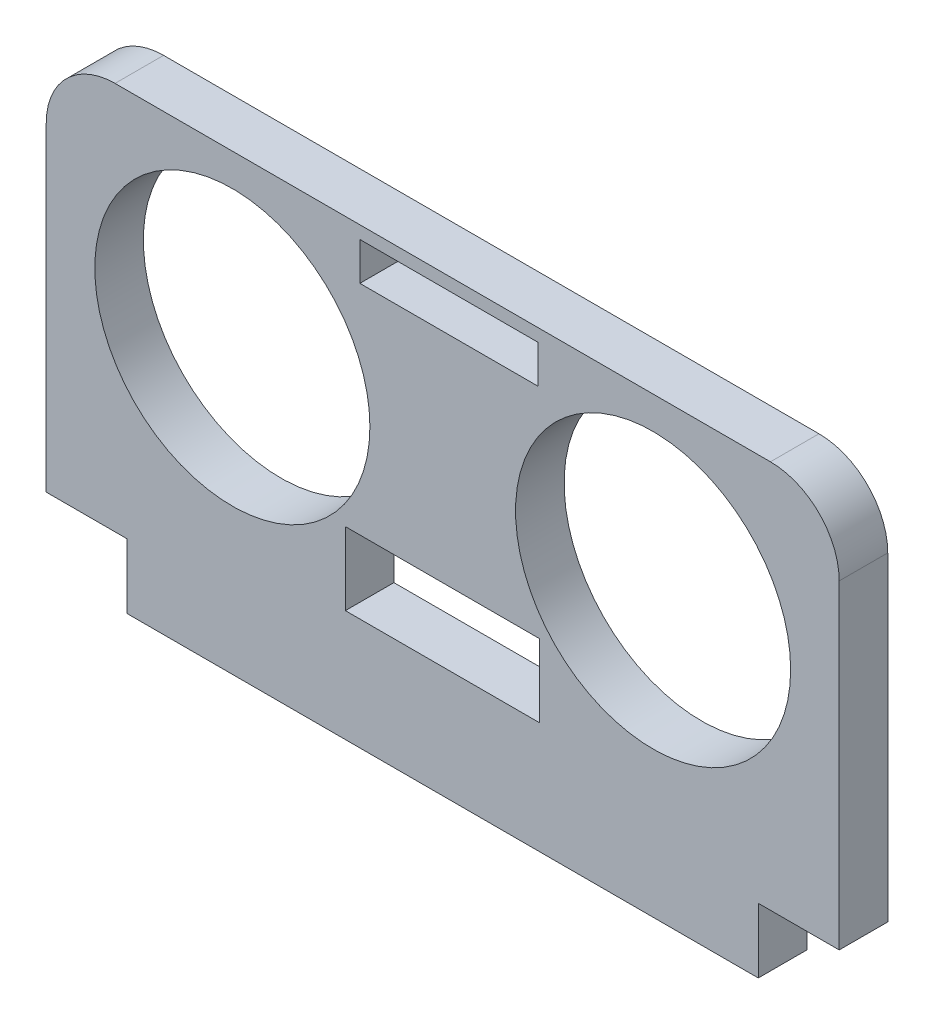
ISO-10303-21;
HEADER;
FILE_DESCRIPTION(('STEP AP214'),'2;1');
FILE_NAME('part.step','',(''),(''),'','','');
FILE_SCHEMA(('AUTOMOTIVE_DESIGN { 1 0 10303 214 1 1 1 1 }'));
ENDSEC;
DATA;
#1=APPLICATION_CONTEXT('core data for automotive mechanical design processes');
#2=APPLICATION_PROTOCOL_DEFINITION('international standard','automotive_design',2000,#1);
#3=PRODUCT_CONTEXT('',#1,'mechanical');
#4=PRODUCT('Part','Part','',(#3));
#5=PRODUCT_RELATED_PRODUCT_CATEGORY('part','',(#4));
#6=PRODUCT_DEFINITION_FORMATION('','',#4);
#7=PRODUCT_DEFINITION_CONTEXT('part definition',#1,'design');
#8=PRODUCT_DEFINITION('design','',#6,#7);
#9=PRODUCT_DEFINITION_SHAPE('','',#8);
#10=(LENGTH_UNIT() NAMED_UNIT(*) SI_UNIT(.MILLI.,.METRE.));
#11=(NAMED_UNIT(*) PLANE_ANGLE_UNIT() SI_UNIT($,.RADIAN.));
#12=(NAMED_UNIT(*) SI_UNIT($,.STERADIAN.) SOLID_ANGLE_UNIT());
#13=UNCERTAINTY_MEASURE_WITH_UNIT(LENGTH_MEASURE(1.E-05),#10,'distance_accuracy_value','');
#14=(GEOMETRIC_REPRESENTATION_CONTEXT(3) GLOBAL_UNCERTAINTY_ASSIGNED_CONTEXT((#13)) GLOBAL_UNIT_ASSIGNED_CONTEXT((#10,
#11,#12)) REPRESENTATION_CONTEXT('',''));
#15=CARTESIAN_POINT('',(0.,0.,0.));
#16=DIRECTION('',(0.,0.,1.));
#17=DIRECTION('',(1.,0.,0.));
#18=AXIS2_PLACEMENT_3D('',#15,#16,#17);
#19=CARTESIAN_POINT('',(-22.9735145661851,14.6917065986435,3.));
#20=DIRECTION('',(0.,0.,-1.));
#21=DIRECTION('',(-1.,0.,0.));
#22=AXIS2_PLACEMENT_3D('',#19,#20,#21);
#23=PLANE('',#22);
#24=DIRECTION('',(0.,-1.,0.));
#25=VECTOR('',#24,1.);
#26=CARTESIAN_POINT('',(-49.2402979014695,2.34191465970292,3.));
#27=LINE('',#26,#25);
#28=CARTESIAN_POINT('',(-49.2402979014695,2.34191465970292,3.));
#29=VERTEX_POINT('',#28);
#30=CARTESIAN_POINT('',(-49.2402979014695,-2.15808534029708,3.));
#31=VERTEX_POINT('',#30);
#32=EDGE_CURVE('E193',#29,#31,#27,.T.);
#33=ORIENTED_EDGE('',*,*,#32,.F.);
#34=DIRECTION('',(-1.,0.,0.));
#35=VECTOR('',#34,1.);
#36=CARTESIAN_POINT('',(-49.2402979014695,2.34191465970292,3.));
#37=LINE('',#36,#35);
#38=CARTESIAN_POINT('',(-37.2402979014695,2.34191465970292,3.));
#39=VERTEX_POINT('',#38);
#40=EDGE_CURVE('E201',#39,#29,#37,.T.);
#41=ORIENTED_EDGE('',*,*,#40,.F.);
#42=DIRECTION('',(0.,1.,0.));
#43=VECTOR('',#42,1.);
#44=CARTESIAN_POINT('',(-37.2402979014695,2.34191465970292,3.));
#45=LINE('',#44,#43);
#46=CARTESIAN_POINT('',(-37.2402979014695,-2.15808534029708,3.));
#47=VERTEX_POINT('',#46);
#48=EDGE_CURVE('E198',#47,#39,#45,.T.);
#49=ORIENTED_EDGE('',*,*,#48,.F.);
#50=DIRECTION('',(1.,0.,0.));
#51=VECTOR('',#50,1.);
#52=CARTESIAN_POINT('',(-49.2402979014695,-2.15808534029708,3.));
#53=LINE('',#52,#51);
#54=EDGE_CURVE('E195',#31,#47,#53,.T.);
#55=ORIENTED_EDGE('',*,*,#54,.F.);
#56=EDGE_LOOP('',(#33,#41,#49,#55));
#57=FACE_BOUND('',#56,.T.);
#58=DIRECTION('',(0.,-1.,0.));
#59=VECTOR('',#58,1.);
#60=CARTESIAN_POINT('',(-62.7235145661851,-5.05829340135652,3.));
#61=LINE('',#60,#59);
#62=CARTESIAN_POINT('',(-62.7235145661851,-5.05829340135652,3.));
#63=VERTEX_POINT('',#62);
#64=CARTESIAN_POINT('',(-62.7235145661851,-9.05829340135652,3.));
#65=VERTEX_POINT('',#64);
#66=EDGE_CURVE('E236',#63,#65,#61,.T.);
#67=ORIENTED_EDGE('',*,*,#66,.T.);
#68=DIRECTION('',(1.,0.,0.));
#69=VECTOR('',#68,1.);
#70=CARTESIAN_POINT('',(-62.7235145661851,-9.05829340135652,3.));
#71=LINE('',#70,#69);
#72=CARTESIAN_POINT('',(-23.7235145661851,-9.05829340135652,3.));
#73=VERTEX_POINT('',#72);
#74=EDGE_CURVE('E239',#65,#73,#71,.T.);
#75=ORIENTED_EDGE('',*,*,#74,.T.);
#76=DIRECTION('',(0.,1.,0.));
#77=VECTOR('',#76,1.);
#78=CARTESIAN_POINT('',(-23.7235145661851,-5.05829340135652,3.));
#79=LINE('',#78,#77);
#80=CARTESIAN_POINT('',(-23.7235145661851,-5.05829340135652,3.));
#81=VERTEX_POINT('',#80);
#82=EDGE_CURVE('E242',#73,#81,#79,.T.);
#83=ORIENTED_EDGE('',*,*,#82,.T.);
#84=DIRECTION('',(1.,0.,0.));
#85=VECTOR('',#84,1.);
#86=CARTESIAN_POINT('',(-18.7235145661851,-5.05829340135652,3.));
#87=LINE('',#86,#85);
#88=CARTESIAN_POINT('',(-18.7235145661851,-5.05829340135652,3.));
#89=VERTEX_POINT('',#88);
#90=EDGE_CURVE('E244',#81,#89,#87,.T.);
#91=ORIENTED_EDGE('',*,*,#90,.T.);
#92=DIRECTION('',(0.,1.,0.));
#93=VECTOR('',#92,1.);
#94=CARTESIAN_POINT('',(-18.7235145661851,-5.05829340135652,3.));
#95=LINE('',#94,#93);
#96=CARTESIAN_POINT('',(-18.7235145661851,14.6917065986435,3.));
#97=VERTEX_POINT('',#96);
#98=EDGE_CURVE('E246',#89,#97,#95,.T.);
#99=ORIENTED_EDGE('',*,*,#98,.T.);
#100=CARTESIAN_POINT('',(-22.9735145661851,14.6917065986435,3.));
#101=DIRECTION('',(0.,0.,1.));
#102=DIRECTION('',(-1.,0.,0.));
#103=AXIS2_PLACEMENT_3D('',#100,#101,#102);
#104=CIRCLE('',#103,4.25);
#105=CARTESIAN_POINT('',(-22.9735145661851,18.9417065986435,3.));
#106=VERTEX_POINT('',#105);
#107=EDGE_CURVE('E248',#97,#106,#104,.T.);
#108=ORIENTED_EDGE('',*,*,#107,.T.);
#109=DIRECTION('',(-1.,0.,0.));
#110=VECTOR('',#109,1.);
#111=CARTESIAN_POINT('',(-22.9735145661851,18.9417065986435,3.));
#112=LINE('',#111,#110);
#113=CARTESIAN_POINT('',(-63.4735145661851,18.9417065986435,3.));
#114=VERTEX_POINT('',#113);
#115=EDGE_CURVE('E250',#106,#114,#112,.T.);
#116=ORIENTED_EDGE('',*,*,#115,.T.);
#117=CARTESIAN_POINT('',(-63.4735145661851,14.6917065986435,3.));
#118=DIRECTION('',(0.,0.,1.));
#119=DIRECTION('',(1.,0.,0.));
#120=AXIS2_PLACEMENT_3D('',#117,#118,#119);
#121=CIRCLE('',#120,4.25);
#122=CARTESIAN_POINT('',(-67.7235145661851,14.6917065986435,3.));
#123=VERTEX_POINT('',#122);
#124=EDGE_CURVE('E252',#114,#123,#121,.T.);
#125=ORIENTED_EDGE('',*,*,#124,.T.);
#126=DIRECTION('',(0.,-1.,0.));
#127=VECTOR('',#126,1.);
#128=CARTESIAN_POINT('',(-67.7235145661851,14.6917065986435,3.));
#129=LINE('',#128,#127);
#130=CARTESIAN_POINT('',(-67.7235145661851,-5.05829340135652,3.));
#131=VERTEX_POINT('',#130);
#132=EDGE_CURVE('E254',#123,#131,#129,.T.);
#133=ORIENTED_EDGE('',*,*,#132,.T.);
#134=DIRECTION('',(1.,0.,0.));
#135=VECTOR('',#134,1.);
#136=CARTESIAN_POINT('',(-67.7235145661851,-5.05829340135652,3.));
#137=LINE('',#136,#135);
#138=EDGE_CURVE('E256',#131,#63,#137,.T.);
#139=ORIENTED_EDGE('',*,*,#138,.T.);
#140=EDGE_LOOP('',(#67,#75,#83,#91,#99,#108,#116,#125,#133,#139));
#141=FACE_BOUND('',#140,.T.);
#142=CARTESIAN_POINT('',(-56.2235145661851,8.44170659864349,3.));
#143=DIRECTION('',(0.,0.,1.));
#144=DIRECTION('',(1.,0.,0.));
#145=AXIS2_PLACEMENT_3D('',#142,#143,#144);
#146=CIRCLE('',#145,8.5);
#147=CARTESIAN_POINT('',(-47.7235145661851,8.44170659864349,3.));
#148=VERTEX_POINT('',#147);
#149=EDGE_CURVE('E230',#148,#148,#146,.T.);
#150=ORIENTED_EDGE('',*,*,#149,.F.);
#151=EDGE_LOOP('',(#150));
#152=FACE_BOUND('',#151,.T.);
#153=CARTESIAN_POINT('',(-30.2235145661851,8.44170659864349,3.));
#154=DIRECTION('',(0.,0.,1.));
#155=DIRECTION('',(1.,0.,0.));
#156=AXIS2_PLACEMENT_3D('',#153,#154,#155);
#157=CIRCLE('',#156,8.5);
#158=CARTESIAN_POINT('',(-21.7235145661851,8.44170659864349,3.));
#159=VERTEX_POINT('',#158);
#160=EDGE_CURVE('E224',#159,#159,#157,.T.);
#161=ORIENTED_EDGE('',*,*,#160,.F.);
#162=EDGE_LOOP('',(#161));
#163=FACE_BOUND('',#162,.T.);
#164=DIRECTION('',(0.,-1.,0.));
#165=VECTOR('',#164,1.);
#166=CARTESIAN_POINT('',(-48.3444822603578,18.154921863778,3.));
#167=LINE('',#166,#165);
#168=CARTESIAN_POINT('',(-48.3444822603578,18.154921863778,3.));
#169=VERTEX_POINT('',#168);
#170=CARTESIAN_POINT('',(-48.3444822603578,15.804921863778,3.));
#171=VERTEX_POINT('',#170);
#172=EDGE_CURVE('E157',#169,#171,#167,.T.);
#173=ORIENTED_EDGE('',*,*,#172,.F.);
#174=DIRECTION('',(-1.,0.,0.));
#175=VECTOR('',#174,1.);
#176=CARTESIAN_POINT('',(-48.3444822603578,18.154921863778,3.));
#177=LINE('',#176,#175);
#178=CARTESIAN_POINT('',(-37.3444822603578,18.154921863778,3.));
#179=VERTEX_POINT('',#178);
#180=EDGE_CURVE('E179',#179,#169,#177,.T.);
#181=ORIENTED_EDGE('',*,*,#180,.F.);
#182=DIRECTION('',(0.,1.,0.));
#183=VECTOR('',#182,1.);
#184=CARTESIAN_POINT('',(-37.3444822603578,18.154921863778,3.));
#185=LINE('',#184,#183);
#186=CARTESIAN_POINT('',(-37.3444822603578,15.804921863778,3.));
#187=VERTEX_POINT('',#186);
#188=EDGE_CURVE('E177',#187,#179,#185,.T.);
#189=ORIENTED_EDGE('',*,*,#188,.F.);
#190=DIRECTION('',(1.,0.,0.));
#191=VECTOR('',#190,1.);
#192=CARTESIAN_POINT('',(-48.3444822603578,15.804921863778,3.));
#193=LINE('',#192,#191);
#194=EDGE_CURVE('E165',#171,#187,#193,.T.);
#195=ORIENTED_EDGE('',*,*,#194,.F.);
#196=EDGE_LOOP('',(#173,#181,#189,#195));
#197=FACE_BOUND('',#196,.T.);
#198=ADVANCED_FACE('F32',(#57,#141,#152,#163,#197),#23,.F.);
#199=CARTESIAN_POINT('',(-22.9735145661851,14.6917065986435,0.));
#200=DIRECTION('',(0.,0.,-1.));
#201=DIRECTION('',(-1.,0.,0.));
#202=AXIS2_PLACEMENT_3D('',#199,#200,#201);
#203=PLANE('',#202);
#204=CARTESIAN_POINT('',(-56.2235145661851,8.44170659864349,0.));
#205=DIRECTION('',(0.,0.,1.));
#206=DIRECTION('',(1.,0.,0.));
#207=AXIS2_PLACEMENT_3D('',#204,#205,#206);
#208=CIRCLE('',#207,8.5);
#209=CARTESIAN_POINT('',(-47.7235145661851,8.44170659864349,0.));
#210=VERTEX_POINT('',#209);
#211=EDGE_CURVE('E227',#210,#210,#208,.T.);
#212=ORIENTED_EDGE('',*,*,#211,.T.);
#213=EDGE_LOOP('',(#212));
#214=FACE_BOUND('',#213,.T.);
#215=DIRECTION('',(0.,-1.,0.));
#216=VECTOR('',#215,1.);
#217=CARTESIAN_POINT('',(-62.7235145661851,-5.05829340135652,0.));
#218=LINE('',#217,#216);
#219=CARTESIAN_POINT('',(-62.7235145661851,-5.05829340135652,0.));
#220=VERTEX_POINT('',#219);
#221=CARTESIAN_POINT('',(-62.7235145661851,-9.05829340135652,0.));
#222=VERTEX_POINT('',#221);
#223=EDGE_CURVE('E233',#220,#222,#218,.T.);
#224=ORIENTED_EDGE('',*,*,#223,.F.);
#225=DIRECTION('',(1.,0.,0.));
#226=VECTOR('',#225,1.);
#227=CARTESIAN_POINT('',(-67.7235145661851,-5.05829340135652,0.));
#228=LINE('',#227,#226);
#229=CARTESIAN_POINT('',(-67.7235145661851,-5.05829340135652,0.));
#230=VERTEX_POINT('',#229);
#231=EDGE_CURVE('E240',#230,#220,#228,.T.);
#232=ORIENTED_EDGE('',*,*,#231,.F.);
#233=DIRECTION('',(0.,-1.,0.));
#234=VECTOR('',#233,1.);
#235=CARTESIAN_POINT('',(-67.7235145661851,14.6917065986435,0.));
#236=LINE('',#235,#234);
#237=CARTESIAN_POINT('',(-67.7235145661851,14.6917065986435,0.));
#238=VERTEX_POINT('',#237);
#239=EDGE_CURVE('E275',#238,#230,#236,.T.);
#240=ORIENTED_EDGE('',*,*,#239,.F.);
#241=CARTESIAN_POINT('',(-63.4735145661851,14.6917065986435,0.));
#242=DIRECTION('',(0.,0.,1.));
#243=DIRECTION('',(1.,0.,0.));
#244=AXIS2_PLACEMENT_3D('',#241,#242,#243);
#245=CIRCLE('',#244,4.25);
#246=CARTESIAN_POINT('',(-63.4735145661851,18.9417065986435,0.));
#247=VERTEX_POINT('',#246);
#248=EDGE_CURVE('E273',#247,#238,#245,.T.);
#249=ORIENTED_EDGE('',*,*,#248,.F.);
#250=DIRECTION('',(-1.,0.,0.));
#251=VECTOR('',#250,1.);
#252=CARTESIAN_POINT('',(-22.9735145661851,18.9417065986435,0.));
#253=LINE('',#252,#251);
#254=CARTESIAN_POINT('',(-22.9735145661851,18.9417065986435,0.));
#255=VERTEX_POINT('',#254);
#256=EDGE_CURVE('E271',#255,#247,#253,.T.);
#257=ORIENTED_EDGE('',*,*,#256,.F.);
#258=CARTESIAN_POINT('',(-22.9735145661851,14.6917065986435,0.));
#259=DIRECTION('',(0.,0.,1.));
#260=DIRECTION('',(-1.,0.,0.));
#261=AXIS2_PLACEMENT_3D('',#258,#259,#260);
#262=CIRCLE('',#261,4.25);
#263=CARTESIAN_POINT('',(-18.7235145661851,14.6917065986435,0.));
#264=VERTEX_POINT('',#263);
#265=EDGE_CURVE('E269',#264,#255,#262,.T.);
#266=ORIENTED_EDGE('',*,*,#265,.F.);
#267=DIRECTION('',(0.,1.,0.));
#268=VECTOR('',#267,1.);
#269=CARTESIAN_POINT('',(-18.7235145661851,-5.05829340135652,0.));
#270=LINE('',#269,#268);
#271=CARTESIAN_POINT('',(-18.7235145661851,-5.05829340135652,0.));
#272=VERTEX_POINT('',#271);
#273=EDGE_CURVE('E267',#272,#264,#270,.T.);
#274=ORIENTED_EDGE('',*,*,#273,.F.);
#275=DIRECTION('',(1.,0.,0.));
#276=VECTOR('',#275,1.);
#277=CARTESIAN_POINT('',(-18.7235145661851,-5.05829340135652,0.));
#278=LINE('',#277,#276);
#279=CARTESIAN_POINT('',(-23.7235145661851,-5.05829340135652,0.));
#280=VERTEX_POINT('',#279);
#281=EDGE_CURVE('E265',#280,#272,#278,.T.);
#282=ORIENTED_EDGE('',*,*,#281,.F.);
#283=DIRECTION('',(0.,1.,0.));
#284=VECTOR('',#283,1.);
#285=CARTESIAN_POINT('',(-23.7235145661851,-5.05829340135652,0.));
#286=LINE('',#285,#284);
#287=CARTESIAN_POINT('',(-23.7235145661851,-9.05829340135652,0.));
#288=VERTEX_POINT('',#287);
#289=EDGE_CURVE('E263',#288,#280,#286,.T.);
#290=ORIENTED_EDGE('',*,*,#289,.F.);
#291=DIRECTION('',(1.,0.,0.));
#292=VECTOR('',#291,1.);
#293=CARTESIAN_POINT('',(-62.7235145661851,-9.05829340135652,0.));
#294=LINE('',#293,#292);
#295=EDGE_CURVE('E261',#222,#288,#294,.T.);
#296=ORIENTED_EDGE('',*,*,#295,.F.);
#297=EDGE_LOOP('',(#224,#232,#240,#249,#257,#266,#274,#282,#290,#296));
#298=FACE_BOUND('',#297,.T.);
#299=CARTESIAN_POINT('',(-30.2235145661851,8.44170659864349,0.));
#300=DIRECTION('',(0.,0.,1.));
#301=DIRECTION('',(1.,0.,0.));
#302=AXIS2_PLACEMENT_3D('',#299,#300,#301);
#303=CIRCLE('',#302,8.5);
#304=CARTESIAN_POINT('',(-21.7235145661851,8.44170659864349,0.));
#305=VERTEX_POINT('',#304);
#306=EDGE_CURVE('E223',#305,#305,#303,.T.);
#307=ORIENTED_EDGE('',*,*,#306,.T.);
#308=EDGE_LOOP('',(#307));
#309=FACE_BOUND('',#308,.T.);
#310=DIRECTION('',(-1.,0.,0.));
#311=VECTOR('',#310,1.);
#312=CARTESIAN_POINT('',(-49.2402979014695,2.34191465970292,0.));
#313=LINE('',#312,#311);
#314=CARTESIAN_POINT('',(-37.2402979014695,2.34191465970292,0.));
#315=VERTEX_POINT('',#314);
#316=CARTESIAN_POINT('',(-49.2402979014695,2.34191465970292,0.));
#317=VERTEX_POINT('',#316);
#318=EDGE_CURVE('E196',#315,#317,#313,.T.);
#319=ORIENTED_EDGE('',*,*,#318,.T.);
#320=DIRECTION('',(0.,-1.,0.));
#321=VECTOR('',#320,1.);
#322=CARTESIAN_POINT('',(-49.2402979014695,2.34191465970292,0.));
#323=LINE('',#322,#321);
#324=CARTESIAN_POINT('',(-49.2402979014695,-2.15808534029708,0.));
#325=VERTEX_POINT('',#324);
#326=EDGE_CURVE('E173',#317,#325,#323,.T.);
#327=ORIENTED_EDGE('',*,*,#326,.T.);
#328=DIRECTION('',(1.,0.,0.));
#329=VECTOR('',#328,1.);
#330=CARTESIAN_POINT('',(-49.2402979014695,-2.15808534029708,0.));
#331=LINE('',#330,#329);
#332=CARTESIAN_POINT('',(-37.2402979014695,-2.15808534029708,0.));
#333=VERTEX_POINT('',#332);
#334=EDGE_CURVE('E206',#325,#333,#331,.T.);
#335=ORIENTED_EDGE('',*,*,#334,.T.);
#336=DIRECTION('',(0.,1.,0.));
#337=VECTOR('',#336,1.);
#338=CARTESIAN_POINT('',(-37.2402979014695,2.34191465970292,0.));
#339=LINE('',#338,#337);
#340=EDGE_CURVE('E209',#333,#315,#339,.T.);
#341=ORIENTED_EDGE('',*,*,#340,.T.);
#342=EDGE_LOOP('',(#319,#327,#335,#341));
#343=FACE_BOUND('',#342,.T.);
#344=DIRECTION('',(-1.,0.,0.));
#345=VECTOR('',#344,1.);
#346=CARTESIAN_POINT('',(-48.3444822603578,18.154921863778,0.));
#347=LINE('',#346,#345);
#348=CARTESIAN_POINT('',(-37.3444822603578,18.154921863778,0.));
#349=VERTEX_POINT('',#348);
#350=CARTESIAN_POINT('',(-48.3444822603578,18.154921863778,0.));
#351=VERTEX_POINT('',#350);
#352=EDGE_CURVE('E166',#349,#351,#347,.T.);
#353=ORIENTED_EDGE('',*,*,#352,.T.);
#354=DIRECTION('',(0.,-1.,0.));
#355=VECTOR('',#354,1.);
#356=CARTESIAN_POINT('',(-48.3444822603578,18.154921863778,0.));
#357=LINE('',#356,#355);
#358=CARTESIAN_POINT('',(-48.3444822603578,15.804921863778,0.));
#359=VERTEX_POINT('',#358);
#360=EDGE_CURVE('E55',#351,#359,#357,.T.);
#361=ORIENTED_EDGE('',*,*,#360,.T.);
#362=DIRECTION('',(1.,0.,0.));
#363=VECTOR('',#362,1.);
#364=CARTESIAN_POINT('',(-48.3444822603578,15.804921863778,0.));
#365=LINE('',#364,#363);
#366=CARTESIAN_POINT('',(-37.3444822603578,15.804921863778,0.));
#367=VERTEX_POINT('',#366);
#368=EDGE_CURVE('E172',#359,#367,#365,.T.);
#369=ORIENTED_EDGE('',*,*,#368,.T.);
#370=DIRECTION('',(0.,1.,0.));
#371=VECTOR('',#370,1.);
#372=CARTESIAN_POINT('',(-37.3444822603578,18.154921863778,0.));
#373=LINE('',#372,#371);
#374=EDGE_CURVE('E185',#367,#349,#373,.T.);
#375=ORIENTED_EDGE('',*,*,#374,.T.);
#376=EDGE_LOOP('',(#353,#361,#369,#375));
#377=FACE_BOUND('',#376,.T.);
#378=ADVANCED_FACE('F311',(#214,#298,#309,#343,#377),#203,.T.);
#379=CARTESIAN_POINT('',(-62.7235145661851,-5.05829340135652,3.));
#380=DIRECTION('',(1.,0.,0.));
#381=DIRECTION('',(0.,0.,-1.));
#382=AXIS2_PLACEMENT_3D('',#379,#380,#381);
#383=PLANE('',#382);
#384=ORIENTED_EDGE('',*,*,#223,.T.);
#385=DIRECTION('',(0.,0.,-1.));
#386=VECTOR('',#385,1.);
#387=CARTESIAN_POINT('',(-62.7235145661851,-9.05829340135652,3.));
#388=LINE('',#387,#386);
#389=EDGE_CURVE('E11',#65,#222,#388,.T.);
#390=ORIENTED_EDGE('',*,*,#389,.F.);
#391=ORIENTED_EDGE('',*,*,#66,.F.);
#392=DIRECTION('',(0.,0.,-1.));
#393=VECTOR('',#392,1.);
#394=CARTESIAN_POINT('',(-62.7235145661851,-5.05829340135652,3.));
#395=LINE('',#394,#393);
#396=EDGE_CURVE('E258',#63,#220,#395,.T.);
#397=ORIENTED_EDGE('',*,*,#396,.T.);
#398=EDGE_LOOP('',(#384,#390,#391,#397));
#399=FACE_BOUND('',#398,.T.);
#400=ADVANCED_FACE('F34',(#399),#383,.F.);
#401=CARTESIAN_POINT('',(-62.7235145661851,-9.05829340135652,3.));
#402=DIRECTION('',(0.,1.,0.));
#403=DIRECTION('',(0.,0.,1.));
#404=AXIS2_PLACEMENT_3D('',#401,#402,#403);
#405=PLANE('',#404);
#406=ORIENTED_EDGE('',*,*,#295,.T.);
#407=DIRECTION('',(0.,0.,-1.));
#408=VECTOR('',#407,1.);
#409=CARTESIAN_POINT('',(-23.7235145661851,-9.05829340135652,3.));
#410=LINE('',#409,#408);
#411=EDGE_CURVE('E40',#73,#288,#410,.T.);
#412=ORIENTED_EDGE('',*,*,#411,.F.);
#413=ORIENTED_EDGE('',*,*,#74,.F.);
#414=ORIENTED_EDGE('',*,*,#389,.T.);
#415=EDGE_LOOP('',(#406,#412,#413,#414));
#416=FACE_BOUND('',#415,.T.);
#417=ADVANCED_FACE('F329',(#416),#405,.F.);
#418=CARTESIAN_POINT('',(-23.7235145661851,-5.05829340135652,3.));
#419=DIRECTION('',(-1.,0.,0.));
#420=DIRECTION('',(0.,-1.,0.));
#421=AXIS2_PLACEMENT_3D('',#418,#419,#420);
#422=PLANE('',#421);
#423=ORIENTED_EDGE('',*,*,#289,.T.);
#424=DIRECTION('',(0.,0.,-1.));
#425=VECTOR('',#424,1.);
#426=CARTESIAN_POINT('',(-23.7235145661851,-5.05829340135652,3.));
#427=LINE('',#426,#425);
#428=EDGE_CURVE('E298',#81,#280,#427,.T.);
#429=ORIENTED_EDGE('',*,*,#428,.F.);
#430=ORIENTED_EDGE('',*,*,#82,.F.);
#431=ORIENTED_EDGE('',*,*,#411,.T.);
#432=EDGE_LOOP('',(#423,#429,#430,#431));
#433=FACE_BOUND('',#432,.T.);
#434=ADVANCED_FACE('F305',(#433),#422,.F.);
#435=CARTESIAN_POINT('',(-18.7235145661851,-5.05829340135652,3.));
#436=DIRECTION('',(0.,1.,0.));
#437=DIRECTION('',(-1.,0.,0.));
#438=AXIS2_PLACEMENT_3D('',#435,#436,#437);
#439=PLANE('',#438);
#440=ORIENTED_EDGE('',*,*,#281,.T.);
#441=DIRECTION('',(0.,0.,-1.));
#442=VECTOR('',#441,1.);
#443=CARTESIAN_POINT('',(-18.7235145661851,-5.05829340135652,3.));
#444=LINE('',#443,#442);
#445=EDGE_CURVE('E295',#89,#272,#444,.T.);
#446=ORIENTED_EDGE('',*,*,#445,.F.);
#447=ORIENTED_EDGE('',*,*,#90,.F.);
#448=ORIENTED_EDGE('',*,*,#428,.T.);
#449=EDGE_LOOP('',(#440,#446,#447,#448));
#450=FACE_BOUND('',#449,.T.);
#451=ADVANCED_FACE('F317',(#450),#439,.F.);
#452=CARTESIAN_POINT('',(-18.7235145661851,-5.05829340135652,3.));
#453=DIRECTION('',(-1.,0.,0.));
#454=DIRECTION('',(0.,-1.,0.));
#455=AXIS2_PLACEMENT_3D('',#452,#453,#454);
#456=PLANE('',#455);
#457=ORIENTED_EDGE('',*,*,#273,.T.);
#458=DIRECTION('',(0.,0.,-1.));
#459=VECTOR('',#458,1.);
#460=CARTESIAN_POINT('',(-18.7235145661851,14.6917065986435,3.));
#461=LINE('',#460,#459);
#462=EDGE_CURVE('E292',#97,#264,#461,.T.);
#463=ORIENTED_EDGE('',*,*,#462,.F.);
#464=ORIENTED_EDGE('',*,*,#98,.F.);
#465=ORIENTED_EDGE('',*,*,#445,.T.);
#466=EDGE_LOOP('',(#457,#463,#464,#465));
#467=FACE_BOUND('',#466,.T.);
#468=ADVANCED_FACE('F321',(#467),#456,.F.);
#469=CARTESIAN_POINT('',(-22.9735145661851,14.6917065986435,3.));
#470=DIRECTION('',(0.,0.,-1.));
#471=DIRECTION('',(-1.,0.,0.));
#472=AXIS2_PLACEMENT_3D('',#469,#470,#471);
#473=CYLINDRICAL_SURFACE('',#472,4.25);
#474=ORIENTED_EDGE('',*,*,#265,.T.);
#475=DIRECTION('',(0.,0.,-1.));
#476=VECTOR('',#475,1.);
#477=CARTESIAN_POINT('',(-22.9735145661851,18.9417065986435,3.));
#478=LINE('',#477,#476);
#479=EDGE_CURVE('E289',#106,#255,#478,.T.);
#480=ORIENTED_EDGE('',*,*,#479,.F.);
#481=ORIENTED_EDGE('',*,*,#107,.F.);
#482=ORIENTED_EDGE('',*,*,#462,.T.);
#483=EDGE_LOOP('',(#474,#480,#481,#482));
#484=FACE_BOUND('',#483,.T.);
#485=ADVANCED_FACE('F352',(#484),#473,.T.);
#486=CARTESIAN_POINT('',(-22.9735145661851,18.9417065986435,3.));
#487=DIRECTION('',(0.,-1.,0.));
#488=DIRECTION('',(1.,0.,0.));
#489=AXIS2_PLACEMENT_3D('',#486,#487,#488);
#490=PLANE('',#489);
#491=ORIENTED_EDGE('',*,*,#256,.T.);
#492=DIRECTION('',(0.,0.,-1.));
#493=VECTOR('',#492,1.);
#494=CARTESIAN_POINT('',(-63.4735145661851,18.9417065986435,3.));
#495=LINE('',#494,#493);
#496=EDGE_CURVE('E286',#114,#247,#495,.T.);
#497=ORIENTED_EDGE('',*,*,#496,.F.);
#498=ORIENTED_EDGE('',*,*,#115,.F.);
#499=ORIENTED_EDGE('',*,*,#479,.T.);
#500=EDGE_LOOP('',(#491,#497,#498,#499));
#501=FACE_BOUND('',#500,.T.);
#502=ADVANCED_FACE('F349',(#501),#490,.F.);
#503=CARTESIAN_POINT('',(-63.4735145661851,14.6917065986435,3.));
#504=DIRECTION('',(0.,0.,-1.));
#505=DIRECTION('',(-1.,0.,0.));
#506=AXIS2_PLACEMENT_3D('',#503,#504,#505);
#507=CYLINDRICAL_SURFACE('',#506,4.25);
#508=ORIENTED_EDGE('',*,*,#248,.T.);
#509=DIRECTION('',(0.,0.,-1.));
#510=VECTOR('',#509,1.);
#511=CARTESIAN_POINT('',(-67.7235145661851,14.6917065986435,3.));
#512=LINE('',#511,#510);
#513=EDGE_CURVE('E283',#123,#238,#512,.T.);
#514=ORIENTED_EDGE('',*,*,#513,.F.);
#515=ORIENTED_EDGE('',*,*,#124,.F.);
#516=ORIENTED_EDGE('',*,*,#496,.T.);
#517=EDGE_LOOP('',(#508,#514,#515,#516));
#518=FACE_BOUND('',#517,.T.);
#519=ADVANCED_FACE('F345',(#518),#507,.T.);
#520=CARTESIAN_POINT('',(-67.7235145661851,14.6917065986435,3.));
#521=DIRECTION('',(1.,0.,0.));
#522=DIRECTION('',(0.,0.,-1.));
#523=AXIS2_PLACEMENT_3D('',#520,#521,#522);
#524=PLANE('',#523);
#525=ORIENTED_EDGE('',*,*,#239,.T.);
#526=DIRECTION('',(0.,0.,-1.));
#527=VECTOR('',#526,1.);
#528=CARTESIAN_POINT('',(-67.7235145661851,-5.05829340135652,3.));
#529=LINE('',#528,#527);
#530=EDGE_CURVE('E280',#131,#230,#529,.T.);
#531=ORIENTED_EDGE('',*,*,#530,.F.);
#532=ORIENTED_EDGE('',*,*,#132,.F.);
#533=ORIENTED_EDGE('',*,*,#513,.T.);
#534=EDGE_LOOP('',(#525,#531,#532,#533));
#535=FACE_BOUND('',#534,.T.);
#536=ADVANCED_FACE('F341',(#535),#524,.F.);
#537=CARTESIAN_POINT('',(-67.7235145661851,-5.05829340135652,3.));
#538=DIRECTION('',(0.,1.,0.));
#539=DIRECTION('',(0.,0.,1.));
#540=AXIS2_PLACEMENT_3D('',#537,#538,#539);
#541=PLANE('',#540);
#542=ORIENTED_EDGE('',*,*,#231,.T.);
#543=ORIENTED_EDGE('',*,*,#396,.F.);
#544=ORIENTED_EDGE('',*,*,#138,.F.);
#545=ORIENTED_EDGE('',*,*,#530,.T.);
#546=EDGE_LOOP('',(#542,#543,#544,#545));
#547=FACE_BOUND('',#546,.T.);
#548=ADVANCED_FACE('F336',(#547),#541,.F.);
#549=CARTESIAN_POINT('',(-56.2235145661851,8.44170659864349,3.));
#550=DIRECTION('',(0.,0.,-1.));
#551=DIRECTION('',(-1.,0.,0.));
#552=AXIS2_PLACEMENT_3D('',#549,#550,#551);
#553=CYLINDRICAL_SURFACE('',#552,8.5);
#554=ORIENTED_EDGE('',*,*,#149,.T.);
#555=EDGE_LOOP('',(#554));
#556=FACE_BOUND('',#555,.T.);
#557=ORIENTED_EDGE('',*,*,#211,.F.);
#558=EDGE_LOOP('',(#557));
#559=FACE_BOUND('',#558,.T.);
#560=ADVANCED_FACE('F371',(#556,#559),#553,.F.);
#561=CARTESIAN_POINT('',(-30.2235145661851,8.44170659864349,3.));
#562=DIRECTION('',(0.,0.,-1.));
#563=DIRECTION('',(-1.,0.,0.));
#564=AXIS2_PLACEMENT_3D('',#561,#562,#563);
#565=CYLINDRICAL_SURFACE('',#564,8.5);
#566=ORIENTED_EDGE('',*,*,#160,.T.);
#567=EDGE_LOOP('',(#566));
#568=FACE_BOUND('',#567,.T.);
#569=ORIENTED_EDGE('',*,*,#306,.F.);
#570=EDGE_LOOP('',(#569));
#571=FACE_BOUND('',#570,.T.);
#572=ADVANCED_FACE('F397',(#568,#571),#565,.F.);
#573=CARTESIAN_POINT('',(-49.2402979014695,2.34191465970292,3.));
#574=DIRECTION('',(1.,0.,0.));
#575=DIRECTION('',(0.,0.,-1.));
#576=AXIS2_PLACEMENT_3D('',#573,#574,#575);
#577=PLANE('',#576);
#578=ORIENTED_EDGE('',*,*,#326,.F.);
#579=DIRECTION('',(0.,0.,-1.));
#580=VECTOR('',#579,1.);
#581=CARTESIAN_POINT('',(-49.2402979014695,2.34191465970292,3.));
#582=LINE('',#581,#580);
#583=EDGE_CURVE('E203',#29,#317,#582,.T.);
#584=ORIENTED_EDGE('',*,*,#583,.F.);
#585=ORIENTED_EDGE('',*,*,#32,.T.);
#586=DIRECTION('',(0.,0.,-1.));
#587=VECTOR('',#586,1.);
#588=CARTESIAN_POINT('',(-49.2402979014695,-2.15808534029708,3.));
#589=LINE('',#588,#587);
#590=EDGE_CURVE('E220',#31,#325,#589,.T.);
#591=ORIENTED_EDGE('',*,*,#590,.T.);
#592=EDGE_LOOP('',(#578,#584,#585,#591));
#593=FACE_BOUND('',#592,.T.);
#594=ADVANCED_FACE('F404',(#593),#577,.T.);
#595=CARTESIAN_POINT('',(-49.2402979014695,-2.15808534029708,3.));
#596=DIRECTION('',(0.,1.,0.));
#597=DIRECTION('',(0.,0.,1.));
#598=AXIS2_PLACEMENT_3D('',#595,#596,#597);
#599=PLANE('',#598);
#600=ORIENTED_EDGE('',*,*,#334,.F.);
#601=ORIENTED_EDGE('',*,*,#590,.F.);
#602=ORIENTED_EDGE('',*,*,#54,.T.);
#603=DIRECTION('',(0.,0.,-1.));
#604=VECTOR('',#603,1.);
#605=CARTESIAN_POINT('',(-37.2402979014695,-2.15808534029708,3.));
#606=LINE('',#605,#604);
#607=EDGE_CURVE('E218',#47,#333,#606,.T.);
#608=ORIENTED_EDGE('',*,*,#607,.T.);
#609=EDGE_LOOP('',(#600,#601,#602,#608));
#610=FACE_BOUND('',#609,.T.);
#611=ADVANCED_FACE('F411',(#610),#599,.T.);
#612=CARTESIAN_POINT('',(-37.2402979014695,2.34191465970292,3.));
#613=DIRECTION('',(-1.,0.,0.));
#614=DIRECTION('',(0.,0.,1.));
#615=AXIS2_PLACEMENT_3D('',#612,#613,#614);
#616=PLANE('',#615);
#617=ORIENTED_EDGE('',*,*,#340,.F.);
#618=ORIENTED_EDGE('',*,*,#607,.F.);
#619=ORIENTED_EDGE('',*,*,#48,.T.);
#620=DIRECTION('',(0.,0.,-1.));
#621=VECTOR('',#620,1.);
#622=CARTESIAN_POINT('',(-37.2402979014695,2.34191465970292,3.));
#623=LINE('',#622,#621);
#624=EDGE_CURVE('E216',#39,#315,#623,.T.);
#625=ORIENTED_EDGE('',*,*,#624,.T.);
#626=EDGE_LOOP('',(#617,#618,#619,#625));
#627=FACE_BOUND('',#626,.T.);
#628=ADVANCED_FACE('F419',(#627),#616,.T.);
#629=CARTESIAN_POINT('',(-49.2402979014695,2.34191465970292,3.));
#630=DIRECTION('',(0.,-1.,0.));
#631=DIRECTION('',(0.,0.,-1.));
#632=AXIS2_PLACEMENT_3D('',#629,#630,#631);
#633=PLANE('',#632);
#634=ORIENTED_EDGE('',*,*,#318,.F.);
#635=ORIENTED_EDGE('',*,*,#624,.F.);
#636=ORIENTED_EDGE('',*,*,#40,.T.);
#637=ORIENTED_EDGE('',*,*,#583,.T.);
#638=EDGE_LOOP('',(#634,#635,#636,#637));
#639=FACE_BOUND('',#638,.T.);
#640=ADVANCED_FACE('F427',(#639),#633,.T.);
#641=CARTESIAN_POINT('',(-48.3444822603578,18.154921863778,3.));
#642=DIRECTION('',(1.,0.,0.));
#643=DIRECTION('',(0.,0.,-1.));
#644=AXIS2_PLACEMENT_3D('',#641,#642,#643);
#645=PLANE('',#644);
#646=ORIENTED_EDGE('',*,*,#360,.F.);
#647=DIRECTION('',(0.,0.,-1.));
#648=VECTOR('',#647,1.);
#649=CARTESIAN_POINT('',(-48.3444822603578,18.154921863778,3.));
#650=LINE('',#649,#648);
#651=EDGE_CURVE('E161',#169,#351,#650,.T.);
#652=ORIENTED_EDGE('',*,*,#651,.F.);
#653=ORIENTED_EDGE('',*,*,#172,.T.);
#654=DIRECTION('',(0.,0.,-1.));
#655=VECTOR('',#654,1.);
#656=CARTESIAN_POINT('',(-48.3444822603578,15.804921863778,3.));
#657=LINE('',#656,#655);
#658=EDGE_CURVE('E160',#171,#359,#657,.T.);
#659=ORIENTED_EDGE('',*,*,#658,.T.);
#660=EDGE_LOOP('',(#646,#652,#653,#659));
#661=FACE_BOUND('',#660,.T.);
#662=ADVANCED_FACE('F159',(#661),#645,.T.);
#663=CARTESIAN_POINT('',(-48.3444822603578,15.804921863778,3.));
#664=DIRECTION('',(0.,1.,0.));
#665=DIRECTION('',(0.,0.,1.));
#666=AXIS2_PLACEMENT_3D('',#663,#664,#665);
#667=PLANE('',#666);
#668=ORIENTED_EDGE('',*,*,#368,.F.);
#669=ORIENTED_EDGE('',*,*,#658,.F.);
#670=ORIENTED_EDGE('',*,*,#194,.T.);
#671=DIRECTION('',(0.,0.,-1.));
#672=VECTOR('',#671,1.);
#673=CARTESIAN_POINT('',(-37.3444822603578,15.804921863778,3.));
#674=LINE('',#673,#672);
#675=EDGE_CURVE('E174',#187,#367,#674,.T.);
#676=ORIENTED_EDGE('',*,*,#675,.T.);
#677=EDGE_LOOP('',(#668,#669,#670,#676));
#678=FACE_BOUND('',#677,.T.);
#679=ADVANCED_FACE('F169',(#678),#667,.T.);
#680=CARTESIAN_POINT('',(-37.3444822603578,18.154921863778,3.));
#681=DIRECTION('',(-1.,0.,0.));
#682=DIRECTION('',(0.,0.,1.));
#683=AXIS2_PLACEMENT_3D('',#680,#681,#682);
#684=PLANE('',#683);
#685=ORIENTED_EDGE('',*,*,#374,.F.);
#686=ORIENTED_EDGE('',*,*,#675,.F.);
#687=ORIENTED_EDGE('',*,*,#188,.T.);
#688=DIRECTION('',(0.,0.,-1.));
#689=VECTOR('',#688,1.);
#690=CARTESIAN_POINT('',(-37.3444822603578,18.154921863778,3.));
#691=LINE('',#690,#689);
#692=EDGE_CURVE('E47',#179,#349,#691,.T.);
#693=ORIENTED_EDGE('',*,*,#692,.T.);
#694=EDGE_LOOP('',(#685,#686,#687,#693));
#695=FACE_BOUND('',#694,.T.);
#696=ADVANCED_FACE('F448',(#695),#684,.T.);
#697=CARTESIAN_POINT('',(-48.3444822603578,18.154921863778,3.));
#698=DIRECTION('',(0.,-1.,0.));
#699=DIRECTION('',(0.,0.,-1.));
#700=AXIS2_PLACEMENT_3D('',#697,#698,#699);
#701=PLANE('',#700);
#702=ORIENTED_EDGE('',*,*,#352,.F.);
#703=ORIENTED_EDGE('',*,*,#692,.F.);
#704=ORIENTED_EDGE('',*,*,#180,.T.);
#705=ORIENTED_EDGE('',*,*,#651,.T.);
#706=EDGE_LOOP('',(#702,#703,#704,#705));
#707=FACE_BOUND('',#706,.T.);
#708=ADVANCED_FACE('F455',(#707),#701,.T.);
#709=CLOSED_SHELL('',(#198,#378,#400,#417,#434,#451,#468,#485,#502,#519,#536,#548,#560,#572,
#594,#611,#628,#640,#662,#679,#696,#708));
#710=MANIFOLD_SOLID_BREP('B2',#709);
#711=ADVANCED_BREP_SHAPE_REPRESENTATION('',(#18,#710),#14);
#712=SHAPE_DEFINITION_REPRESENTATION(#9,#711);
ENDSEC;
END-ISO-10303-21;
